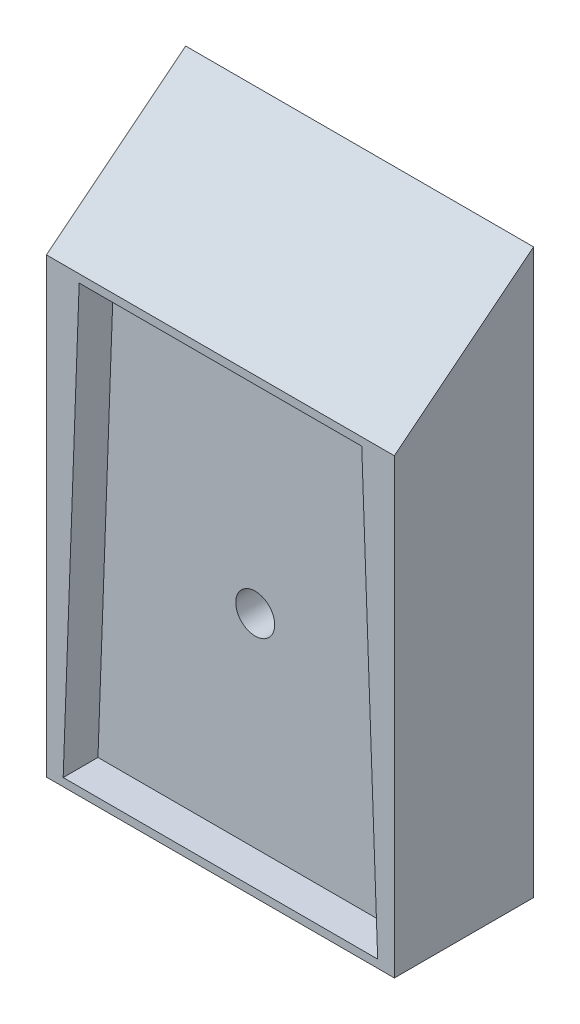
ISO-10303-21;
HEADER;
FILE_DESCRIPTION(('STEP AP214'),'2;1');
FILE_NAME('part.step','',(''),(''),'','','');
FILE_SCHEMA(('AUTOMOTIVE_DESIGN { 1 0 10303 214 1 1 1 1 }'));
ENDSEC;
DATA;
#1=APPLICATION_CONTEXT('core data for automotive mechanical design processes');
#2=APPLICATION_PROTOCOL_DEFINITION('international standard','automotive_design',2000,#1);
#3=PRODUCT_CONTEXT('',#1,'mechanical');
#4=PRODUCT('Part','Part','',(#3));
#5=PRODUCT_RELATED_PRODUCT_CATEGORY('part','',(#4));
#6=PRODUCT_DEFINITION_FORMATION('','',#4);
#7=PRODUCT_DEFINITION_CONTEXT('part definition',#1,'design');
#8=PRODUCT_DEFINITION('design','',#6,#7);
#9=PRODUCT_DEFINITION_SHAPE('','',#8);
#10=(LENGTH_UNIT() NAMED_UNIT(*) SI_UNIT(.MILLI.,.METRE.));
#11=(NAMED_UNIT(*) PLANE_ANGLE_UNIT() SI_UNIT($,.RADIAN.));
#12=(NAMED_UNIT(*) SI_UNIT($,.STERADIAN.) SOLID_ANGLE_UNIT());
#13=UNCERTAINTY_MEASURE_WITH_UNIT(LENGTH_MEASURE(1.E-05),#10,'distance_accuracy_value','');
#14=(GEOMETRIC_REPRESENTATION_CONTEXT(3) GLOBAL_UNCERTAINTY_ASSIGNED_CONTEXT((#13)) GLOBAL_UNIT_ASSIGNED_CONTEXT((#10,
#11,#12)) REPRESENTATION_CONTEXT('',''));
#15=CARTESIAN_POINT('',(0.,0.,0.));
#16=DIRECTION('',(0.,0.,1.));
#17=DIRECTION('',(1.,0.,0.));
#18=AXIS2_PLACEMENT_3D('',#15,#16,#17);
#19=CARTESIAN_POINT('',(0.,-2.15,5.));
#20=DIRECTION('',(0.,0.,1.));
#21=DIRECTION('',(1.,0.,0.));
#22=AXIS2_PLACEMENT_3D('',#19,#20,#21);
#23=CYLINDRICAL_SURFACE('',#22,2.8);
#24=CARTESIAN_POINT('',(0.,-2.15,15.));
#25=DIRECTION('',(0.,0.,1.));
#26=DIRECTION('',(1.,0.,0.));
#27=AXIS2_PLACEMENT_3D('',#24,#25,#26);
#28=CIRCLE('',#27,2.8);
#29=CARTESIAN_POINT('',(2.8,-2.15,15.));
#30=VERTEX_POINT('',#29);
#31=EDGE_CURVE('E369',#30,#30,#28,.T.);
#32=ORIENTED_EDGE('',*,*,#31,.T.);
#33=EDGE_LOOP('',(#32));
#34=FACE_BOUND('',#33,.T.);
#35=CARTESIAN_POINT('',(0.,-2.15,10.));
#36=DIRECTION('',(0.,0.,-1.));
#37=DIRECTION('',(-1.,0.,0.));
#38=AXIS2_PLACEMENT_3D('',#35,#36,#37);
#39=CIRCLE('',#38,2.8);
#40=CARTESIAN_POINT('',(-2.8,-2.15,10.));
#41=VERTEX_POINT('',#40);
#42=EDGE_CURVE('E44',#41,#41,#39,.F.);
#43=ORIENTED_EDGE('',*,*,#42,.F.);
#44=EDGE_LOOP('',(#43));
#45=FACE_BOUND('',#44,.T.);
#46=ADVANCED_FACE('F40',(#34,#45),#23,.F.);
#47=CARTESIAN_POINT('',(-25.,32.5,20.));
#48=DIRECTION('',(1.,0.,0.));
#49=DIRECTION('',(0.,1.,0.));
#50=AXIS2_PLACEMENT_3D('',#47,#48,#49);
#51=PLANE('',#50);
#52=DIRECTION('',(0.,-1.,0.));
#53=VECTOR('',#52,1.);
#54=CARTESIAN_POINT('',(-25.,32.5,0.));
#55=LINE('',#54,#53);
#56=CARTESIAN_POINT('',(-25.,48.5,0.));
#57=VERTEX_POINT('',#56);
#58=CARTESIAN_POINT('',(-25.,-32.5,0.));
#59=VERTEX_POINT('',#58);
#60=EDGE_CURVE('E167',#57,#59,#55,.T.);
#61=ORIENTED_EDGE('',*,*,#60,.T.);
#62=DIRECTION('',(0.,0.,-1.));
#63=VECTOR('',#62,1.);
#64=CARTESIAN_POINT('',(-25.,-32.5,20.));
#65=LINE('',#64,#63);
#66=CARTESIAN_POINT('',(-25.,-32.5,20.));
#67=VERTEX_POINT('',#66);
#68=EDGE_CURVE('E12',#67,#59,#65,.T.);
#69=ORIENTED_EDGE('',*,*,#68,.F.);
#70=DIRECTION('',(0.,-1.,0.));
#71=VECTOR('',#70,1.);
#72=CARTESIAN_POINT('',(-25.,32.5,20.));
#73=LINE('',#72,#71);
#74=CARTESIAN_POINT('',(-25.,32.5,20.));
#75=VERTEX_POINT('',#74);
#76=EDGE_CURVE('E168',#75,#67,#73,.T.);
#77=ORIENTED_EDGE('',*,*,#76,.F.);
#78=DIRECTION('',(0.,-0.624695047554424,0.78086880944303));
#79=VECTOR('',#78,1.);
#80=CARTESIAN_POINT('',(-25.,48.5,0.));
#81=LINE('',#80,#79);
#82=EDGE_CURVE('E156',#57,#75,#81,.T.);
#83=ORIENTED_EDGE('',*,*,#82,.F.);
#84=EDGE_LOOP('',(#61,#69,#77,#83));
#85=FACE_BOUND('',#84,.T.);
#86=ADVANCED_FACE('F42',(#85),#51,.F.);
#87=CARTESIAN_POINT('',(-25.,-32.5,20.));
#88=DIRECTION('',(0.,1.,0.));
#89=DIRECTION('',(0.,0.,1.));
#90=AXIS2_PLACEMENT_3D('',#87,#88,#89);
#91=PLANE('',#90);
#92=DIRECTION('',(1.,0.,0.));
#93=VECTOR('',#92,1.);
#94=CARTESIAN_POINT('',(-25.,-32.5,0.));
#95=LINE('',#94,#93);
#96=CARTESIAN_POINT('',(25.,-32.5,0.));
#97=VERTEX_POINT('',#96);
#98=EDGE_CURVE('E80',#59,#97,#95,.T.);
#99=ORIENTED_EDGE('',*,*,#98,.T.);
#100=DIRECTION('',(0.,0.,-1.));
#101=VECTOR('',#100,1.);
#102=CARTESIAN_POINT('',(25.,-32.5,20.));
#103=LINE('',#102,#101);
#104=CARTESIAN_POINT('',(25.,-32.5,20.));
#105=VERTEX_POINT('',#104);
#106=EDGE_CURVE('E50',#105,#97,#103,.T.);
#107=ORIENTED_EDGE('',*,*,#106,.F.);
#108=DIRECTION('',(1.,0.,0.));
#109=VECTOR('',#108,1.);
#110=CARTESIAN_POINT('',(-25.,-32.5,20.));
#111=LINE('',#110,#109);
#112=EDGE_CURVE('E85',#67,#105,#111,.T.);
#113=ORIENTED_EDGE('',*,*,#112,.F.);
#114=ORIENTED_EDGE('',*,*,#68,.T.);
#115=EDGE_LOOP('',(#99,#107,#113,#114));
#116=FACE_BOUND('',#115,.T.);
#117=ADVANCED_FACE('F209',(#116),#91,.F.);
#118=CARTESIAN_POINT('',(25.,32.5,20.));
#119=DIRECTION('',(-1.,0.,0.));
#120=DIRECTION('',(0.,0.,1.));
#121=AXIS2_PLACEMENT_3D('',#118,#119,#120);
#122=PLANE('',#121);
#123=DIRECTION('',(0.,1.,0.));
#124=VECTOR('',#123,1.);
#125=CARTESIAN_POINT('',(25.,32.5,0.));
#126=LINE('',#125,#124);
#127=CARTESIAN_POINT('',(25.,48.5,0.));
#128=VERTEX_POINT('',#127);
#129=EDGE_CURVE('E171',#97,#128,#126,.T.);
#130=ORIENTED_EDGE('',*,*,#129,.T.);
#131=DIRECTION('',(0.,-0.624695047554424,0.78086880944303));
#132=VECTOR('',#131,1.);
#133=CARTESIAN_POINT('',(25.,48.5,0.));
#134=LINE('',#133,#132);
#135=CARTESIAN_POINT('',(25.,32.5,20.));
#136=VERTEX_POINT('',#135);
#137=EDGE_CURVE('E154',#128,#136,#134,.T.);
#138=ORIENTED_EDGE('',*,*,#137,.T.);
#139=DIRECTION('',(0.,1.,0.));
#140=VECTOR('',#139,1.);
#141=CARTESIAN_POINT('',(25.,32.5,20.));
#142=LINE('',#141,#140);
#143=EDGE_CURVE('E174',#105,#136,#142,.T.);
#144=ORIENTED_EDGE('',*,*,#143,.F.);
#145=ORIENTED_EDGE('',*,*,#106,.T.);
#146=EDGE_LOOP('',(#130,#138,#144,#145));
#147=FACE_BOUND('',#146,.T.);
#148=ADVANCED_FACE('F190',(#147),#122,.F.);
#149=CARTESIAN_POINT('',(0.,0.,20.));
#150=DIRECTION('',(0.,0.,1.));
#151=DIRECTION('',(1.,0.,0.));
#152=AXIS2_PLACEMENT_3D('',#149,#150,#151);
#153=PLANE('',#152);
#154=DIRECTION('',(1.,0.,0.));
#155=VECTOR('',#154,1.);
#156=CARTESIAN_POINT('',(22.6,-31.35,20.));
#157=LINE('',#156,#155);
#158=CARTESIAN_POINT('',(-22.6,-31.35,20.));
#159=VERTEX_POINT('',#158);
#160=CARTESIAN_POINT('',(22.6,-31.35,20.));
#161=VERTEX_POINT('',#160);
#162=EDGE_CURVE('E57',#159,#161,#157,.T.);
#163=ORIENTED_EDGE('',*,*,#162,.F.);
#164=DIRECTION('',(-0.036657960183853,-0.99932787109895,0.));
#165=VECTOR('',#164,1.);
#166=CARTESIAN_POINT('',(-20.3,31.35,20.));
#167=LINE('',#166,#165);
#168=CARTESIAN_POINT('',(-20.3,31.35,20.));
#169=VERTEX_POINT('',#168);
#170=EDGE_CURVE('E137',#169,#159,#167,.T.);
#171=ORIENTED_EDGE('',*,*,#170,.F.);
#172=DIRECTION('',(-1.,0.,0.));
#173=VECTOR('',#172,1.);
#174=CARTESIAN_POINT('',(-20.3,31.35,20.));
#175=LINE('',#174,#173);
#176=CARTESIAN_POINT('',(20.31,31.35,20.));
#177=VERTEX_POINT('',#176);
#178=EDGE_CURVE('E119',#177,#169,#175,.T.);
#179=ORIENTED_EDGE('',*,*,#178,.F.);
#180=DIRECTION('',(-0.0364987905344166,0.999333697165029,0.));
#181=VECTOR('',#180,1.);
#182=CARTESIAN_POINT('',(20.31,31.35,20.));
#183=LINE('',#182,#181);
#184=EDGE_CURVE('E130',#161,#177,#183,.T.);
#185=ORIENTED_EDGE('',*,*,#184,.F.);
#186=EDGE_LOOP('',(#163,#171,#179,#185));
#187=FACE_BOUND('',#186,.T.);
#188=ORIENTED_EDGE('',*,*,#76,.T.);
#189=ORIENTED_EDGE('',*,*,#112,.T.);
#190=ORIENTED_EDGE('',*,*,#143,.T.);
#191=DIRECTION('',(-1.,0.,0.));
#192=VECTOR('',#191,1.);
#193=CARTESIAN_POINT('',(-25.,32.5,20.));
#194=LINE('',#193,#192);
#195=EDGE_CURVE('E66',#136,#75,#194,.T.);
#196=ORIENTED_EDGE('',*,*,#195,.T.);
#197=EDGE_LOOP('',(#188,#189,#190,#196));
#198=FACE_BOUND('',#197,.T.);
#199=ADVANCED_FACE('F135',(#187,#198),#153,.T.);
#200=CARTESIAN_POINT('',(0.,0.,0.));
#201=DIRECTION('',(0.,0.,1.));
#202=DIRECTION('',(1.,0.,0.));
#203=AXIS2_PLACEMENT_3D('',#200,#201,#202);
#204=PLANE('',#203);
#205=CARTESIAN_POINT('',(0.,-2.15,0.));
#206=DIRECTION('',(0.,0.,-1.));
#207=DIRECTION('',(-1.,0.,0.));
#208=AXIS2_PLACEMENT_3D('',#205,#206,#207);
#209=CIRCLE('',#208,7.5);
#210=CARTESIAN_POINT('',(-7.5,-2.15,0.));
#211=VERTEX_POINT('',#210);
#212=EDGE_CURVE('E363',#211,#211,#209,.T.);
#213=ORIENTED_EDGE('',*,*,#212,.F.);
#214=EDGE_LOOP('',(#213));
#215=FACE_BOUND('',#214,.T.);
#216=CARTESIAN_POINT('',(7.1490132204346,24.75,0.));
#217=DIRECTION('',(0.,0.,-1.));
#218=DIRECTION('',(1.,0.,0.));
#219=AXIS2_PLACEMENT_3D('',#216,#217,#218);
#220=CIRCLE('',#219,2.35);
#221=CARTESIAN_POINT('',(9.4990132204346,24.75,0.));
#222=VERTEX_POINT('',#221);
#223=EDGE_CURVE('E386',#222,#222,#220,.T.);
#224=ORIENTED_EDGE('',*,*,#223,.F.);
#225=EDGE_LOOP('',(#224));
#226=FACE_BOUND('',#225,.T.);
#227=CARTESIAN_POINT('',(-7.1490132204346,39.05,0.));
#228=DIRECTION('',(0.,0.,-1.));
#229=DIRECTION('',(1.,0.,0.));
#230=AXIS2_PLACEMENT_3D('',#227,#228,#229);
#231=CIRCLE('',#230,2.35);
#232=CARTESIAN_POINT('',(-4.7990132204346,39.05,0.));
#233=VERTEX_POINT('',#232);
#234=EDGE_CURVE('E377',#233,#233,#231,.T.);
#235=ORIENTED_EDGE('',*,*,#234,.F.);
#236=EDGE_LOOP('',(#235));
#237=FACE_BOUND('',#236,.T.);
#238=CARTESIAN_POINT('',(7.1490132204346,39.05,0.));
#239=DIRECTION('',(0.,0.,-1.));
#240=DIRECTION('',(-1.,0.,0.));
#241=AXIS2_PLACEMENT_3D('',#238,#239,#240);
#242=CIRCLE('',#241,2.35);
#243=CARTESIAN_POINT('',(4.7990132204346,39.05,0.));
#244=VERTEX_POINT('',#243);
#245=EDGE_CURVE('E372',#244,#244,#242,.T.);
#246=ORIENTED_EDGE('',*,*,#245,.F.);
#247=EDGE_LOOP('',(#246));
#248=FACE_BOUND('',#247,.T.);
#249=CARTESIAN_POINT('',(-7.1490132204346,24.75,0.));
#250=DIRECTION('',(0.,0.,-1.));
#251=DIRECTION('',(-1.,0.,0.));
#252=AXIS2_PLACEMENT_3D('',#249,#250,#251);
#253=CIRCLE('',#252,2.35);
#254=CARTESIAN_POINT('',(-9.4990132204346,24.75,0.));
#255=VERTEX_POINT('',#254);
#256=EDGE_CURVE('E385',#255,#255,#253,.T.);
#257=ORIENTED_EDGE('',*,*,#256,.F.);
#258=EDGE_LOOP('',(#257));
#259=FACE_BOUND('',#258,.T.);
#260=ORIENTED_EDGE('',*,*,#60,.F.);
#261=DIRECTION('',(1.,0.,0.));
#262=VECTOR('',#261,1.);
#263=CARTESIAN_POINT('',(-25.,48.5,0.));
#264=LINE('',#263,#262);
#265=EDGE_CURVE('E160',#57,#128,#264,.T.);
#266=ORIENTED_EDGE('',*,*,#265,.T.);
#267=ORIENTED_EDGE('',*,*,#129,.F.);
#268=ORIENTED_EDGE('',*,*,#98,.F.);
#269=EDGE_LOOP('',(#260,#266,#267,#268));
#270=FACE_BOUND('',#269,.T.);
#271=ADVANCED_FACE('F192',(#215,#226,#237,#248,#259,#270),#204,.F.);
#272=CARTESIAN_POINT('',(-25.,48.5,0.));
#273=DIRECTION('',(0.,0.78086880944303,0.624695047554424));
#274=DIRECTION('',(0.,-0.624695047554424,0.78086880944303));
#275=AXIS2_PLACEMENT_3D('',#272,#273,#274);
#276=PLANE('',#275);
#277=ORIENTED_EDGE('',*,*,#137,.F.);
#278=ORIENTED_EDGE('',*,*,#265,.F.);
#279=ORIENTED_EDGE('',*,*,#82,.T.);
#280=ORIENTED_EDGE('',*,*,#195,.F.);
#281=EDGE_LOOP('',(#277,#278,#279,#280));
#282=FACE_BOUND('',#281,.T.);
#283=ADVANCED_FACE('F197',(#282),#276,.T.);
#284=CARTESIAN_POINT('',(22.6,-31.35,-67.293790177478));
#285=DIRECTION('',(0.,-1.,0.));
#286=DIRECTION('',(0.,0.,-1.));
#287=AXIS2_PLACEMENT_3D('',#284,#285,#286);
#288=PLANE('',#287);
#289=DIRECTION('',(-1.,0.,0.));
#290=VECTOR('',#289,1.);
#291=CARTESIAN_POINT('',(22.6,-31.35,15.));
#292=LINE('',#291,#290);
#293=CARTESIAN_POINT('',(22.6,-31.35,15.));
#294=VERTEX_POINT('',#293);
#295=CARTESIAN_POINT('',(-22.6,-31.35,15.));
#296=VERTEX_POINT('',#295);
#297=EDGE_CURVE('E155',#294,#296,#292,.T.);
#298=ORIENTED_EDGE('',*,*,#297,.T.);
#299=DIRECTION('',(0.,0.,1.));
#300=VECTOR('',#299,1.);
#301=CARTESIAN_POINT('',(-22.6,-31.35,-67.293790177478));
#302=LINE('',#301,#300);
#303=EDGE_CURVE('E144',#296,#159,#302,.T.);
#304=ORIENTED_EDGE('',*,*,#303,.T.);
#305=ORIENTED_EDGE('',*,*,#162,.T.);
#306=DIRECTION('',(0.,0.,1.));
#307=VECTOR('',#306,1.);
#308=CARTESIAN_POINT('',(22.6,-31.35,-67.293790177478));
#309=LINE('',#308,#307);
#310=EDGE_CURVE('E127',#294,#161,#309,.T.);
#311=ORIENTED_EDGE('',*,*,#310,.F.);
#312=EDGE_LOOP('',(#298,#304,#305,#311));
#313=FACE_BOUND('',#312,.T.);
#314=ADVANCED_FACE('F265',(#313),#288,.F.);
#315=CARTESIAN_POINT('',(-20.3,31.35,-67.293790177478));
#316=DIRECTION('',(-0.99932787109895,0.036657960183853,0.));
#317=DIRECTION('',(-0.036657960183853,-0.99932787109895,0.));
#318=AXIS2_PLACEMENT_3D('',#315,#316,#317);
#319=PLANE('',#318);
#320=DIRECTION('',(0.036657960183853,0.99932787109895,0.));
#321=VECTOR('',#320,1.);
#322=CARTESIAN_POINT('',(-20.3,31.35,15.));
#323=LINE('',#322,#321);
#324=CARTESIAN_POINT('',(-20.3,31.35,15.));
#325=VERTEX_POINT('',#324);
#326=EDGE_CURVE('E406',#296,#325,#323,.T.);
#327=ORIENTED_EDGE('',*,*,#326,.T.);
#328=DIRECTION('',(0.,0.,1.));
#329=VECTOR('',#328,1.);
#330=CARTESIAN_POINT('',(-20.3,31.35,-67.293790177478));
#331=LINE('',#330,#329);
#332=EDGE_CURVE('E126',#325,#169,#331,.T.);
#333=ORIENTED_EDGE('',*,*,#332,.T.);
#334=ORIENTED_EDGE('',*,*,#170,.T.);
#335=ORIENTED_EDGE('',*,*,#303,.F.);
#336=EDGE_LOOP('',(#327,#333,#334,#335));
#337=FACE_BOUND('',#336,.T.);
#338=ADVANCED_FACE('F262',(#337),#319,.F.);
#339=CARTESIAN_POINT('',(-20.3,31.35,-67.293790177478));
#340=DIRECTION('',(0.,1.,0.));
#341=DIRECTION('',(-1.,0.,0.));
#342=AXIS2_PLACEMENT_3D('',#339,#340,#341);
#343=PLANE('',#342);
#344=DIRECTION('',(1.,0.,0.));
#345=VECTOR('',#344,1.);
#346=CARTESIAN_POINT('',(-20.3,31.35,15.));
#347=LINE('',#346,#345);
#348=CARTESIAN_POINT('',(20.31,31.35,15.));
#349=VERTEX_POINT('',#348);
#350=EDGE_CURVE('E122',#325,#349,#347,.T.);
#351=ORIENTED_EDGE('',*,*,#350,.T.);
#352=DIRECTION('',(0.,0.,1.));
#353=VECTOR('',#352,1.);
#354=CARTESIAN_POINT('',(20.31,31.35,-67.293790177478));
#355=LINE('',#354,#353);
#356=EDGE_CURVE('E114',#349,#177,#355,.T.);
#357=ORIENTED_EDGE('',*,*,#356,.T.);
#358=ORIENTED_EDGE('',*,*,#178,.T.);
#359=ORIENTED_EDGE('',*,*,#332,.F.);
#360=EDGE_LOOP('',(#351,#357,#358,#359));
#361=FACE_BOUND('',#360,.T.);
#362=ADVANCED_FACE('F116',(#361),#343,.F.);
#363=CARTESIAN_POINT('',(20.31,31.35,-67.293790177478));
#364=DIRECTION('',(0.999333697165028,0.0364987905344166,0.));
#365=DIRECTION('',(-0.0364987905344166,0.999333697165029,0.));
#366=AXIS2_PLACEMENT_3D('',#363,#364,#365);
#367=PLANE('',#366);
#368=DIRECTION('',(0.0364987905344166,-0.999333697165029,0.));
#369=VECTOR('',#368,1.);
#370=CARTESIAN_POINT('',(20.31,31.35,15.));
#371=LINE('',#370,#369);
#372=EDGE_CURVE('E151',#349,#294,#371,.T.);
#373=ORIENTED_EDGE('',*,*,#372,.T.);
#374=ORIENTED_EDGE('',*,*,#310,.T.);
#375=ORIENTED_EDGE('',*,*,#184,.T.);
#376=ORIENTED_EDGE('',*,*,#356,.F.);
#377=EDGE_LOOP('',(#373,#374,#375,#376));
#378=FACE_BOUND('',#377,.T.);
#379=ADVANCED_FACE('F131',(#378),#367,.F.);
#380=CARTESIAN_POINT('',(0.,0.,15.));
#381=DIRECTION('',(0.,0.,1.));
#382=DIRECTION('',(1.,0.,0.));
#383=AXIS2_PLACEMENT_3D('',#380,#381,#382);
#384=PLANE('',#383);
#385=ORIENTED_EDGE('',*,*,#31,.F.);
#386=EDGE_LOOP('',(#385));
#387=FACE_BOUND('',#386,.T.);
#388=ORIENTED_EDGE('',*,*,#297,.F.);
#389=ORIENTED_EDGE('',*,*,#372,.F.);
#390=ORIENTED_EDGE('',*,*,#350,.F.);
#391=ORIENTED_EDGE('',*,*,#326,.F.);
#392=EDGE_LOOP('',(#388,#389,#390,#391));
#393=FACE_BOUND('',#392,.T.);
#394=ADVANCED_FACE('F257',(#387,#393),#384,.T.);
#395=CARTESIAN_POINT('',(-7.1490132204346,24.75,8.5));
#396=DIRECTION('',(0.,0.,-1.));
#397=DIRECTION('',(-1.,0.,0.));
#398=AXIS2_PLACEMENT_3D('',#395,#396,#397);
#399=CYLINDRICAL_SURFACE('',#398,2.35);
#400=CARTESIAN_POINT('',(-7.1490132204346,24.75,8.5));
#401=DIRECTION('',(0.,0.,-1.));
#402=DIRECTION('',(-1.,0.,0.));
#403=AXIS2_PLACEMENT_3D('',#400,#401,#402);
#404=CIRCLE('',#403,2.35);
#405=CARTESIAN_POINT('',(-9.4990132204346,24.75,8.5));
#406=VERTEX_POINT('',#405);
#407=EDGE_CURVE('E397',#406,#406,#404,.T.);
#408=ORIENTED_EDGE('',*,*,#407,.F.);
#409=EDGE_LOOP('',(#408));
#410=FACE_BOUND('',#409,.T.);
#411=ORIENTED_EDGE('',*,*,#256,.T.);
#412=EDGE_LOOP('',(#411));
#413=FACE_BOUND('',#412,.T.);
#414=ADVANCED_FACE('F253',(#410,#413),#399,.F.);
#415=CARTESIAN_POINT('',(-7.1490132204346,24.75,8.5));
#416=DIRECTION('',(0.,0.,-1.));
#417=DIRECTION('',(-1.,0.,0.));
#418=AXIS2_PLACEMENT_3D('',#415,#416,#417);
#419=PLANE('',#418);
#420=ORIENTED_EDGE('',*,*,#407,.T.);
#421=EDGE_LOOP('',(#420));
#422=FACE_BOUND('',#421,.T.);
#423=ADVANCED_FACE('F234',(#422),#419,.T.);
#424=CARTESIAN_POINT('',(7.1490132204346,39.05,8.5));
#425=DIRECTION('',(0.,0.,-1.));
#426=DIRECTION('',(-1.,0.,0.));
#427=AXIS2_PLACEMENT_3D('',#424,#425,#426);
#428=CYLINDRICAL_SURFACE('',#427,2.35);
#429=CARTESIAN_POINT('',(7.1490132204346,39.05,8.5));
#430=DIRECTION('',(0.,0.,-1.));
#431=DIRECTION('',(-1.,0.,0.));
#432=AXIS2_PLACEMENT_3D('',#429,#430,#431);
#433=CIRCLE('',#432,2.35);
#434=CARTESIAN_POINT('',(4.7990132204346,39.05,8.5));
#435=VERTEX_POINT('',#434);
#436=EDGE_CURVE('E373',#435,#435,#433,.T.);
#437=ORIENTED_EDGE('',*,*,#436,.F.);
#438=EDGE_LOOP('',(#437));
#439=FACE_BOUND('',#438,.T.);
#440=ORIENTED_EDGE('',*,*,#245,.T.);
#441=EDGE_LOOP('',(#440));
#442=FACE_BOUND('',#441,.T.);
#443=ADVANCED_FACE('F230',(#439,#442),#428,.F.);
#444=CARTESIAN_POINT('',(7.1490132204346,39.05,8.5));
#445=DIRECTION('',(0.,0.,-1.));
#446=DIRECTION('',(-1.,0.,0.));
#447=AXIS2_PLACEMENT_3D('',#444,#445,#446);
#448=PLANE('',#447);
#449=ORIENTED_EDGE('',*,*,#436,.T.);
#450=EDGE_LOOP('',(#449));
#451=FACE_BOUND('',#450,.T.);
#452=ADVANCED_FACE('F226',(#451),#448,.T.);
#453=CARTESIAN_POINT('',(-7.1490132204346,39.05,8.5));
#454=DIRECTION('',(0.,0.,-1.));
#455=DIRECTION('',(-1.,0.,0.));
#456=AXIS2_PLACEMENT_3D('',#453,#454,#455);
#457=CYLINDRICAL_SURFACE('',#456,2.35);
#458=CARTESIAN_POINT('',(-7.1490132204346,39.05,8.5));
#459=DIRECTION('',(0.,0.,-1.));
#460=DIRECTION('',(1.,0.,0.));
#461=AXIS2_PLACEMENT_3D('',#458,#459,#460);
#462=CIRCLE('',#461,2.35);
#463=CARTESIAN_POINT('',(-4.7990132204346,39.05,8.5));
#464=VERTEX_POINT('',#463);
#465=EDGE_CURVE('E390',#464,#464,#462,.T.);
#466=ORIENTED_EDGE('',*,*,#465,.F.);
#467=EDGE_LOOP('',(#466));
#468=FACE_BOUND('',#467,.T.);
#469=ORIENTED_EDGE('',*,*,#234,.T.);
#470=EDGE_LOOP('',(#469));
#471=FACE_BOUND('',#470,.T.);
#472=ADVANCED_FACE('F229',(#468,#471),#457,.F.);
#473=CARTESIAN_POINT('',(-7.1490132204346,39.05,8.5));
#474=DIRECTION('',(0.,0.,1.));
#475=DIRECTION('',(1.,0.,0.));
#476=AXIS2_PLACEMENT_3D('',#473,#474,#475);
#477=PLANE('',#476);
#478=ORIENTED_EDGE('',*,*,#465,.T.);
#479=EDGE_LOOP('',(#478));
#480=FACE_BOUND('',#479,.T.);
#481=ADVANCED_FACE('F243',(#480),#477,.F.);
#482=CARTESIAN_POINT('',(7.1490132204346,24.75,8.5));
#483=DIRECTION('',(0.,0.,-1.));
#484=DIRECTION('',(-1.,0.,0.));
#485=AXIS2_PLACEMENT_3D('',#482,#483,#484);
#486=CYLINDRICAL_SURFACE('',#485,2.35);
#487=CARTESIAN_POINT('',(7.1490132204346,24.75,8.5));
#488=DIRECTION('',(0.,0.,-1.));
#489=DIRECTION('',(1.,0.,0.));
#490=AXIS2_PLACEMENT_3D('',#487,#488,#489);
#491=CIRCLE('',#490,2.35);
#492=CARTESIAN_POINT('',(9.4990132204346,24.75,8.5));
#493=VERTEX_POINT('',#492);
#494=EDGE_CURVE('E381',#493,#493,#491,.T.);
#495=ORIENTED_EDGE('',*,*,#494,.F.);
#496=EDGE_LOOP('',(#495));
#497=FACE_BOUND('',#496,.T.);
#498=ORIENTED_EDGE('',*,*,#223,.T.);
#499=EDGE_LOOP('',(#498));
#500=FACE_BOUND('',#499,.T.);
#501=ADVANCED_FACE('F239',(#497,#500),#486,.F.);
#502=CARTESIAN_POINT('',(7.1490132204346,24.75,8.5));
#503=DIRECTION('',(0.,0.,1.));
#504=DIRECTION('',(1.,0.,0.));
#505=AXIS2_PLACEMENT_3D('',#502,#503,#504);
#506=PLANE('',#505);
#507=ORIENTED_EDGE('',*,*,#494,.T.);
#508=EDGE_LOOP('',(#507));
#509=FACE_BOUND('',#508,.T.);
#510=ADVANCED_FACE('F236',(#509),#506,.F.);
#511=CARTESIAN_POINT('',(0.,-2.15,10.));
#512=DIRECTION('',(0.,0.,-1.));
#513=DIRECTION('',(-1.,0.,0.));
#514=AXIS2_PLACEMENT_3D('',#511,#512,#513);
#515=PLANE('',#514);
#516=CARTESIAN_POINT('',(0.,-2.15,10.));
#517=DIRECTION('',(0.,0.,-1.));
#518=DIRECTION('',(-1.,0.,0.));
#519=AXIS2_PLACEMENT_3D('',#516,#517,#518);
#520=CIRCLE('',#519,7.5);
#521=CARTESIAN_POINT('',(-7.5,-2.15,10.));
#522=VERTEX_POINT('',#521);
#523=EDGE_CURVE('E360',#522,#522,#520,.T.);
#524=ORIENTED_EDGE('',*,*,#523,.T.);
#525=EDGE_LOOP('',(#524));
#526=FACE_BOUND('',#525,.T.);
#527=ORIENTED_EDGE('',*,*,#42,.T.);
#528=EDGE_LOOP('',(#527));
#529=FACE_BOUND('',#528,.T.);
#530=ADVANCED_FACE('F238',(#526,#529),#515,.T.);
#531=CARTESIAN_POINT('',(0.,-2.15,10.));
#532=DIRECTION('',(0.,0.,-1.));
#533=DIRECTION('',(-1.,0.,0.));
#534=AXIS2_PLACEMENT_3D('',#531,#532,#533);
#535=CYLINDRICAL_SURFACE('',#534,7.5);
#536=ORIENTED_EDGE('',*,*,#523,.F.);
#537=EDGE_LOOP('',(#536));
#538=FACE_BOUND('',#537,.T.);
#539=ORIENTED_EDGE('',*,*,#212,.T.);
#540=EDGE_LOOP('',(#539));
#541=FACE_BOUND('',#540,.T.);
#542=ADVANCED_FACE('F224',(#538,#541),#535,.F.);
#543=CLOSED_SHELL('',(#46,#86,#117,#148,#199,#271,#283,#314,#338,#362,#379,#394,#414,#423,#443,
#452,#472,#481,#501,#510,#530,#542));
#544=MANIFOLD_SOLID_BREP('B2',#543);
#545=ADVANCED_BREP_SHAPE_REPRESENTATION('',(#18,#544),#14);
#546=SHAPE_DEFINITION_REPRESENTATION(#9,#545);
ENDSEC;
END-ISO-10303-21;
